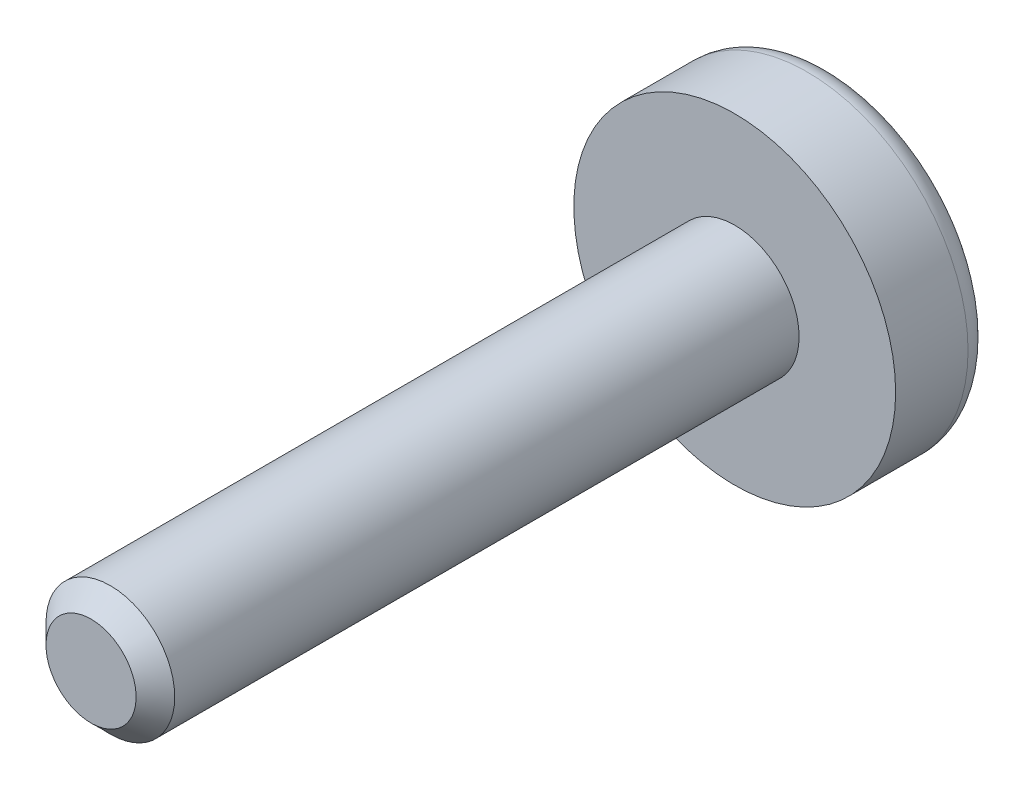
ISO-10303-21;
HEADER;
FILE_DESCRIPTION(('STEP AP214'),'2;1');
FILE_NAME('part.step','',(''),(''),'','','');
FILE_SCHEMA(('AUTOMOTIVE_DESIGN { 1 0 10303 214 1 1 1 1 }'));
ENDSEC;
DATA;
#1=APPLICATION_CONTEXT('core data for automotive mechanical design processes');
#2=APPLICATION_PROTOCOL_DEFINITION('international standard','automotive_design',2000,#1);
#3=PRODUCT_CONTEXT('',#1,'mechanical');
#4=PRODUCT('Part','Part','',(#3));
#5=PRODUCT_RELATED_PRODUCT_CATEGORY('part','',(#4));
#6=PRODUCT_DEFINITION_FORMATION('','',#4);
#7=PRODUCT_DEFINITION_CONTEXT('part definition',#1,'design');
#8=PRODUCT_DEFINITION('design','',#6,#7);
#9=PRODUCT_DEFINITION_SHAPE('','',#8);
#10=(LENGTH_UNIT() NAMED_UNIT(*) SI_UNIT(.MILLI.,.METRE.));
#11=(NAMED_UNIT(*) PLANE_ANGLE_UNIT() SI_UNIT($,.RADIAN.));
#12=(NAMED_UNIT(*) SI_UNIT($,.STERADIAN.) SOLID_ANGLE_UNIT());
#13=UNCERTAINTY_MEASURE_WITH_UNIT(LENGTH_MEASURE(1.E-05),#10,'distance_accuracy_value','');
#14=(GEOMETRIC_REPRESENTATION_CONTEXT(3) GLOBAL_UNCERTAINTY_ASSIGNED_CONTEXT((#13)) GLOBAL_UNIT_ASSIGNED_CONTEXT((#10,
#11,#12)) REPRESENTATION_CONTEXT('',''));
#15=CARTESIAN_POINT('',(0.,0.,0.));
#16=DIRECTION('',(0.,0.,1.));
#17=DIRECTION('',(1.,0.,0.));
#18=AXIS2_PLACEMENT_3D('',#15,#16,#17);
#19=CARTESIAN_POINT('',(0.,0.,10.));
#20=DIRECTION('',(0.,0.,1.));
#21=DIRECTION('',(-1.,0.,0.));
#22=AXIS2_PLACEMENT_3D('',#19,#20,#21);
#23=PLANE('',#22);
#24=CARTESIAN_POINT('',(0.,0.,10.));
#25=DIRECTION('',(0.,0.,-1.));
#26=DIRECTION('',(-1.,0.,0.));
#27=AXIS2_PLACEMENT_3D('',#24,#25,#26);
#28=CIRCLE('',#27,0.699999999999999);
#29=CARTESIAN_POINT('',(-0.699999999999999,0.,10.));
#30=VERTEX_POINT('',#29);
#31=EDGE_CURVE('E140',#30,#30,#28,.T.);
#32=ORIENTED_EDGE('',*,*,#31,.F.);
#33=EDGE_LOOP('',(#32));
#34=FACE_BOUND('',#33,.T.);
#35=ADVANCED_FACE('F41',(#34),#23,.T.);
#36=CARTESIAN_POINT('',(0.,0.,-10.123));
#37=DIRECTION('',(0.,0.,-1.));
#38=DIRECTION('',(1.,0.,0.));
#39=AXIS2_PLACEMENT_3D('',#36,#37,#38);
#40=CYLINDRICAL_SURFACE('',#39,1.);
#41=CARTESIAN_POINT('',(0.,0.,9.7));
#42=DIRECTION('',(0.,0.,-1.));
#43=DIRECTION('',(-1.,0.,0.));
#44=AXIS2_PLACEMENT_3D('',#41,#42,#43);
#45=CIRCLE('',#44,1.);
#46=CARTESIAN_POINT('',(-1.,0.,9.7));
#47=VERTEX_POINT('',#46);
#48=EDGE_CURVE('E137',#47,#47,#45,.F.);
#49=ORIENTED_EDGE('',*,*,#48,.F.);
#50=EDGE_LOOP('',(#49));
#51=FACE_BOUND('',#50,.T.);
#52=CARTESIAN_POINT('',(0.,0.,0.));
#53=DIRECTION('',(0.,0.,1.));
#54=DIRECTION('',(1.,0.,0.));
#55=AXIS2_PLACEMENT_3D('',#52,#53,#54);
#56=CIRCLE('',#55,1.);
#57=CARTESIAN_POINT('',(1.,0.,0.));
#58=VERTEX_POINT('',#57);
#59=EDGE_CURVE('E134',#58,#58,#56,.T.);
#60=ORIENTED_EDGE('',*,*,#59,.T.);
#61=EDGE_LOOP('',(#60));
#62=FACE_BOUND('',#61,.T.);
#63=ADVANCED_FACE('F163',(#51,#62),#40,.T.);
#64=CARTESIAN_POINT('',(1.,0.,0.));
#65=DIRECTION('',(0.,0.,1.));
#66=DIRECTION('',(-1.,0.,0.));
#67=AXIS2_PLACEMENT_3D('',#64,#65,#66);
#68=PLANE('',#67);
#69=ORIENTED_EDGE('',*,*,#59,.F.);
#70=EDGE_LOOP('',(#69));
#71=FACE_BOUND('',#70,.T.);
#72=CARTESIAN_POINT('',(0.,0.,0.));
#73=DIRECTION('',(0.,0.,1.));
#74=DIRECTION('',(1.,0.,0.));
#75=AXIS2_PLACEMENT_3D('',#72,#73,#74);
#76=CIRCLE('',#75,2.5);
#77=CARTESIAN_POINT('',(2.5,0.,0.));
#78=VERTEX_POINT('',#77);
#79=EDGE_CURVE('E131',#78,#78,#76,.T.);
#80=ORIENTED_EDGE('',*,*,#79,.T.);
#81=EDGE_LOOP('',(#80));
#82=FACE_BOUND('',#81,.T.);
#83=ADVANCED_FACE('F157',(#71,#82),#68,.T.);
#84=CARTESIAN_POINT('',(0.,0.,-10.123));
#85=DIRECTION('',(0.,0.,-1.));
#86=DIRECTION('',(1.,0.,0.));
#87=AXIS2_PLACEMENT_3D('',#84,#85,#86);
#88=CYLINDRICAL_SURFACE('',#87,2.5);
#89=CARTESIAN_POINT('',(0.,0.,-1.125));
#90=DIRECTION('',(0.,0.,1.));
#91=DIRECTION('',(1.,0.,0.));
#92=AXIS2_PLACEMENT_3D('',#89,#90,#91);
#93=CIRCLE('',#92,2.5);
#94=CARTESIAN_POINT('',(2.5,0.,-1.125));
#95=VERTEX_POINT('',#94);
#96=EDGE_CURVE('E11',#95,#95,#93,.F.);
#97=ORIENTED_EDGE('',*,*,#96,.F.);
#98=EDGE_LOOP('',(#97));
#99=FACE_BOUND('',#98,.T.);
#100=ORIENTED_EDGE('',*,*,#79,.F.);
#101=EDGE_LOOP('',(#100));
#102=FACE_BOUND('',#101,.T.);
#103=ADVANCED_FACE('F149',(#99,#102),#88,.T.);
#104=CARTESIAN_POINT('',(2.5,0.,-1.5));
#105=DIRECTION('',(0.,0.,-1.));
#106=DIRECTION('',(1.,0.,0.));
#107=AXIS2_PLACEMENT_3D('',#104,#105,#106);
#108=PLANE('',#107);
#109=DIRECTION('',(0.499999999999995,0.866025403784442,0.));
#110=VECTOR('',#109,1.);
#111=CARTESIAN_POINT('',(0.433012701892228,-0.749999999999995,-1.5));
#112=LINE('',#111,#110);
#113=CARTESIAN_POINT('',(0.433012701892228,-0.749999999999995,-1.5));
#114=VERTEX_POINT('',#113);
#115=CARTESIAN_POINT('',(0.866025403784439,0.,-1.5));
#116=VERTEX_POINT('',#115);
#117=EDGE_CURVE('E315',#114,#116,#112,.T.);
#118=ORIENTED_EDGE('',*,*,#117,.T.);
#119=DIRECTION('',(-0.500000000000001,0.866025403784438,0.));
#120=VECTOR('',#119,1.);
#121=CARTESIAN_POINT('',(0.866025403784439,0.,-1.5));
#122=LINE('',#121,#120);
#123=CARTESIAN_POINT('',(0.433012701892218,0.750000000000001,-1.5));
#124=VERTEX_POINT('',#123);
#125=EDGE_CURVE('E310',#116,#124,#122,.T.);
#126=ORIENTED_EDGE('',*,*,#125,.T.);
#127=DIRECTION('',(-1.,0.,0.));
#128=VECTOR('',#127,1.);
#129=CARTESIAN_POINT('',(0.433012701892218,0.750000000000001,-1.5));
#130=LINE('',#129,#128);
#131=CARTESIAN_POINT('',(-0.433012701892223,0.749999999999998,-1.5));
#132=VERTEX_POINT('',#131);
#133=EDGE_CURVE('E314',#124,#132,#130,.T.);
#134=ORIENTED_EDGE('',*,*,#133,.T.);
#135=DIRECTION('',(-0.499999999999995,-0.866025403784442,0.));
#136=VECTOR('',#135,1.);
#137=CARTESIAN_POINT('',(-0.433012701892223,0.749999999999998,-1.5));
#138=LINE('',#137,#136);
#139=CARTESIAN_POINT('',(-0.866025403784439,0.,-1.5));
#140=VERTEX_POINT('',#139);
#141=EDGE_CURVE('E322',#132,#140,#138,.T.);
#142=ORIENTED_EDGE('',*,*,#141,.T.);
#143=DIRECTION('',(0.500000000000007,-0.866025403784434,0.));
#144=VECTOR('',#143,1.);
#145=CARTESIAN_POINT('',(-0.866025403784439,0.,-1.5));
#146=LINE('',#145,#144);
#147=CARTESIAN_POINT('',(-0.433012701892212,-0.750000000000004,-1.5));
#148=VERTEX_POINT('',#147);
#149=EDGE_CURVE('E120',#140,#148,#146,.T.);
#150=ORIENTED_EDGE('',*,*,#149,.T.);
#151=DIRECTION('',(1.,0.,0.));
#152=VECTOR('',#151,1.);
#153=CARTESIAN_POINT('',(-0.433012701892212,-0.750000000000004,-1.5));
#154=LINE('',#153,#152);
#155=EDGE_CURVE('E317',#148,#114,#154,.T.);
#156=ORIENTED_EDGE('',*,*,#155,.T.);
#157=EDGE_LOOP('',(#118,#126,#134,#142,#150,#156));
#158=FACE_BOUND('',#157,.T.);
#159=CARTESIAN_POINT('',(0.,0.,-1.5));
#160=DIRECTION('',(0.,0.,1.));
#161=DIRECTION('',(1.,0.,0.));
#162=AXIS2_PLACEMENT_3D('',#159,#160,#161);
#163=CIRCLE('',#162,2.125);
#164=CARTESIAN_POINT('',(2.125,0.,-1.5));
#165=VERTEX_POINT('',#164);
#166=EDGE_CURVE('E49',#165,#165,#163,.T.);
#167=ORIENTED_EDGE('',*,*,#166,.F.);
#168=EDGE_LOOP('',(#167));
#169=FACE_BOUND('',#168,.T.);
#170=ADVANCED_FACE('F146',(#158,#169),#108,.T.);
#171=CARTESIAN_POINT('',(0.,0.,9.7));
#172=DIRECTION('',(0.,0.,-1.));
#173=DIRECTION('',(1.,0.,0.));
#174=AXIS2_PLACEMENT_3D('',#171,#172,#173);
#175=CONICAL_SURFACE('',#174,1.,0.78539816339745);
#176=ORIENTED_EDGE('',*,*,#31,.T.);
#177=EDGE_LOOP('',(#176));
#178=FACE_BOUND('',#177,.T.);
#179=ORIENTED_EDGE('',*,*,#48,.T.);
#180=EDGE_LOOP('',(#179));
#181=FACE_BOUND('',#180,.T.);
#182=ADVANCED_FACE('F148',(#178,#181),#175,.T.);
#183=CARTESIAN_POINT('',(0.,0.,-1.125));
#184=DIRECTION('',(0.,0.,-1.));
#185=DIRECTION('',(1.,0.,0.));
#186=AXIS2_PLACEMENT_3D('',#183,#184,#185);
#187=TOROIDAL_SURFACE('',#186,2.125,0.375);
#188=ORIENTED_EDGE('',*,*,#96,.T.);
#189=EDGE_LOOP('',(#188));
#190=FACE_BOUND('',#189,.T.);
#191=ORIENTED_EDGE('',*,*,#166,.T.);
#192=EDGE_LOOP('',(#191));
#193=FACE_BOUND('',#192,.T.);
#194=ADVANCED_FACE('F43',(#190,#193),#187,.T.);
#195=CARTESIAN_POINT('',(0.433012701892228,-0.749999999999995,-0.675));
#196=DIRECTION('',(0.866025403784441,-0.499999999999995,0.));
#197=DIRECTION('',(0.499999999999995,0.866025403784442,0.));
#198=AXIS2_PLACEMENT_3D('',#195,#196,#197);
#199=PLANE('',#198);
#200=ORIENTED_EDGE('',*,*,#117,.F.);
#201=DIRECTION('',(0.,0.,-1.));
#202=VECTOR('',#201,1.);
#203=CARTESIAN_POINT('',(0.433012701892228,-0.749999999999995,-0.675));
#204=LINE('',#203,#202);
#205=CARTESIAN_POINT('',(0.433012701892228,-0.749999999999995,-0.675));
#206=VERTEX_POINT('',#205);
#207=EDGE_CURVE('E87',#206,#114,#204,.T.);
#208=ORIENTED_EDGE('',*,*,#207,.F.);
#209=DIRECTION('',(0.499999999999995,0.866025403784442,0.));
#210=VECTOR('',#209,1.);
#211=CARTESIAN_POINT('',(0.433012701892228,-0.749999999999995,-0.675));
#212=LINE('',#211,#210);
#213=CARTESIAN_POINT('',(0.866025403784439,0.,-0.675));
#214=VERTEX_POINT('',#213);
#215=EDGE_CURVE('E325',#206,#214,#212,.T.);
#216=ORIENTED_EDGE('',*,*,#215,.T.);
#217=DIRECTION('',(0.,0.,-1.));
#218=VECTOR('',#217,1.);
#219=CARTESIAN_POINT('',(0.866025403784439,0.,-0.675));
#220=LINE('',#219,#218);
#221=EDGE_CURVE('E56',#214,#116,#220,.T.);
#222=ORIENTED_EDGE('',*,*,#221,.T.);
#223=EDGE_LOOP('',(#200,#208,#216,#222));
#224=FACE_BOUND('',#223,.T.);
#225=ADVANCED_FACE('F210',(#224),#199,.F.);
#226=CARTESIAN_POINT('',(-0.433012701892212,-0.750000000000004,-0.675));
#227=DIRECTION('',(0.,-1.,0.));
#228=DIRECTION('',(1.,0.,0.));
#229=AXIS2_PLACEMENT_3D('',#226,#227,#228);
#230=PLANE('',#229);
#231=ORIENTED_EDGE('',*,*,#155,.F.);
#232=DIRECTION('',(0.,0.,-1.));
#233=VECTOR('',#232,1.);
#234=CARTESIAN_POINT('',(-0.433012701892212,-0.750000000000004,-0.675));
#235=LINE('',#234,#233);
#236=CARTESIAN_POINT('',(-0.433012701892212,-0.750000000000004,-0.675));
#237=VERTEX_POINT('',#236);
#238=EDGE_CURVE('E122',#237,#148,#235,.T.);
#239=ORIENTED_EDGE('',*,*,#238,.F.);
#240=DIRECTION('',(1.,0.,0.));
#241=VECTOR('',#240,1.);
#242=CARTESIAN_POINT('',(-0.433012701892212,-0.750000000000004,-0.675));
#243=LINE('',#242,#241);
#244=EDGE_CURVE('E65',#237,#206,#243,.T.);
#245=ORIENTED_EDGE('',*,*,#244,.T.);
#246=ORIENTED_EDGE('',*,*,#207,.T.);
#247=EDGE_LOOP('',(#231,#239,#245,#246));
#248=FACE_BOUND('',#247,.T.);
#249=ADVANCED_FACE('F220',(#248),#230,.F.);
#250=CARTESIAN_POINT('',(-0.866025403784439,0.,-0.675));
#251=DIRECTION('',(-0.866025403784435,-0.500000000000007,0.));
#252=DIRECTION('',(0.500000000000007,-0.866025403784434,0.));
#253=AXIS2_PLACEMENT_3D('',#250,#251,#252);
#254=PLANE('',#253);
#255=ORIENTED_EDGE('',*,*,#149,.F.);
#256=DIRECTION('',(0.,0.,-1.));
#257=VECTOR('',#256,1.);
#258=CARTESIAN_POINT('',(-0.866025403784439,0.,-0.675));
#259=LINE('',#258,#257);
#260=CARTESIAN_POINT('',(-0.866025403784439,0.,-0.675));
#261=VERTEX_POINT('',#260);
#262=EDGE_CURVE('E109',#261,#140,#259,.T.);
#263=ORIENTED_EDGE('',*,*,#262,.F.);
#264=DIRECTION('',(0.500000000000007,-0.866025403784434,0.));
#265=VECTOR('',#264,1.);
#266=CARTESIAN_POINT('',(-0.866025403784439,0.,-0.675));
#267=LINE('',#266,#265);
#268=EDGE_CURVE('E112',#261,#237,#267,.T.);
#269=ORIENTED_EDGE('',*,*,#268,.T.);
#270=ORIENTED_EDGE('',*,*,#238,.T.);
#271=EDGE_LOOP('',(#255,#263,#269,#270));
#272=FACE_BOUND('',#271,.T.);
#273=ADVANCED_FACE('F118',(#272),#254,.F.);
#274=CARTESIAN_POINT('',(-0.433012701892223,0.749999999999998,-0.675));
#275=DIRECTION('',(-0.866025403784442,0.499999999999995,0.));
#276=DIRECTION('',(-0.499999999999995,-0.866025403784442,0.));
#277=AXIS2_PLACEMENT_3D('',#274,#275,#276);
#278=PLANE('',#277);
#279=ORIENTED_EDGE('',*,*,#141,.F.);
#280=DIRECTION('',(0.,0.,-1.));
#281=VECTOR('',#280,1.);
#282=CARTESIAN_POINT('',(-0.433012701892223,0.749999999999998,-0.675));
#283=LINE('',#282,#281);
#284=CARTESIAN_POINT('',(-0.433012701892223,0.749999999999998,-0.675));
#285=VERTEX_POINT('',#284);
#286=EDGE_CURVE('E111',#285,#132,#283,.T.);
#287=ORIENTED_EDGE('',*,*,#286,.F.);
#288=DIRECTION('',(-0.499999999999995,-0.866025403784442,0.));
#289=VECTOR('',#288,1.);
#290=CARTESIAN_POINT('',(-0.433012701892223,0.749999999999998,-0.675));
#291=LINE('',#290,#289);
#292=EDGE_CURVE('E104',#285,#261,#291,.T.);
#293=ORIENTED_EDGE('',*,*,#292,.T.);
#294=ORIENTED_EDGE('',*,*,#262,.T.);
#295=EDGE_LOOP('',(#279,#287,#293,#294));
#296=FACE_BOUND('',#295,.T.);
#297=ADVANCED_FACE('F107',(#296),#278,.F.);
#298=CARTESIAN_POINT('',(0.433012701892218,0.750000000000001,-0.675));
#299=DIRECTION('',(0.,1.,0.));
#300=DIRECTION('',(-1.,0.,0.));
#301=AXIS2_PLACEMENT_3D('',#298,#299,#300);
#302=PLANE('',#301);
#303=ORIENTED_EDGE('',*,*,#133,.F.);
#304=DIRECTION('',(0.,0.,-1.));
#305=VECTOR('',#304,1.);
#306=CARTESIAN_POINT('',(0.433012701892218,0.750000000000001,-0.675));
#307=LINE('',#306,#305);
#308=CARTESIAN_POINT('',(0.433012701892218,0.750000000000001,-0.675));
#309=VERTEX_POINT('',#308);
#310=EDGE_CURVE('E125',#309,#124,#307,.T.);
#311=ORIENTED_EDGE('',*,*,#310,.F.);
#312=DIRECTION('',(-1.,0.,0.));
#313=VECTOR('',#312,1.);
#314=CARTESIAN_POINT('',(0.433012701892218,0.750000000000001,-0.675));
#315=LINE('',#314,#313);
#316=EDGE_CURVE('E113',#309,#285,#315,.T.);
#317=ORIENTED_EDGE('',*,*,#316,.T.);
#318=ORIENTED_EDGE('',*,*,#286,.T.);
#319=EDGE_LOOP('',(#303,#311,#317,#318));
#320=FACE_BOUND('',#319,.T.);
#321=ADVANCED_FACE('F247',(#320),#302,.F.);
#322=CARTESIAN_POINT('',(0.866025403784439,0.,-0.675));
#323=DIRECTION('',(0.866025403784438,0.500000000000001,0.));
#324=DIRECTION('',(-0.500000000000001,0.866025403784438,0.));
#325=AXIS2_PLACEMENT_3D('',#322,#323,#324);
#326=PLANE('',#325);
#327=ORIENTED_EDGE('',*,*,#125,.F.);
#328=ORIENTED_EDGE('',*,*,#221,.F.);
#329=DIRECTION('',(-0.500000000000001,0.866025403784438,0.));
#330=VECTOR('',#329,1.);
#331=CARTESIAN_POINT('',(0.866025403784439,0.,-0.675));
#332=LINE('',#331,#330);
#333=EDGE_CURVE('E95',#214,#309,#332,.T.);
#334=ORIENTED_EDGE('',*,*,#333,.T.);
#335=ORIENTED_EDGE('',*,*,#310,.T.);
#336=EDGE_LOOP('',(#327,#328,#334,#335));
#337=FACE_BOUND('',#336,.T.);
#338=ADVANCED_FACE('F257',(#337),#326,.F.);
#339=CARTESIAN_POINT('',(0.,0.,-0.675));
#340=DIRECTION('',(0.,0.,-1.));
#341=DIRECTION('',(1.,0.,0.));
#342=AXIS2_PLACEMENT_3D('',#339,#340,#341);
#343=PLANE('',#342);
#344=ORIENTED_EDGE('',*,*,#215,.F.);
#345=ORIENTED_EDGE('',*,*,#244,.F.);
#346=ORIENTED_EDGE('',*,*,#268,.F.);
#347=ORIENTED_EDGE('',*,*,#292,.F.);
#348=ORIENTED_EDGE('',*,*,#316,.F.);
#349=ORIENTED_EDGE('',*,*,#333,.F.);
#350=EDGE_LOOP('',(#344,#345,#346,#347,#348,#349));
#351=FACE_BOUND('',#350,.T.);
#352=ADVANCED_FACE('F115',(#351),#343,.T.);
#353=CLOSED_SHELL('',(#35,#63,#83,#103,#170,#182,#194,#225,#249,#273,#297,#321,#338,#352));
#354=MANIFOLD_SOLID_BREP('B2',#353);
#355=ADVANCED_BREP_SHAPE_REPRESENTATION('',(#18,#354),#14);
#356=SHAPE_DEFINITION_REPRESENTATION(#9,#355);
ENDSEC;
END-ISO-10303-21;
